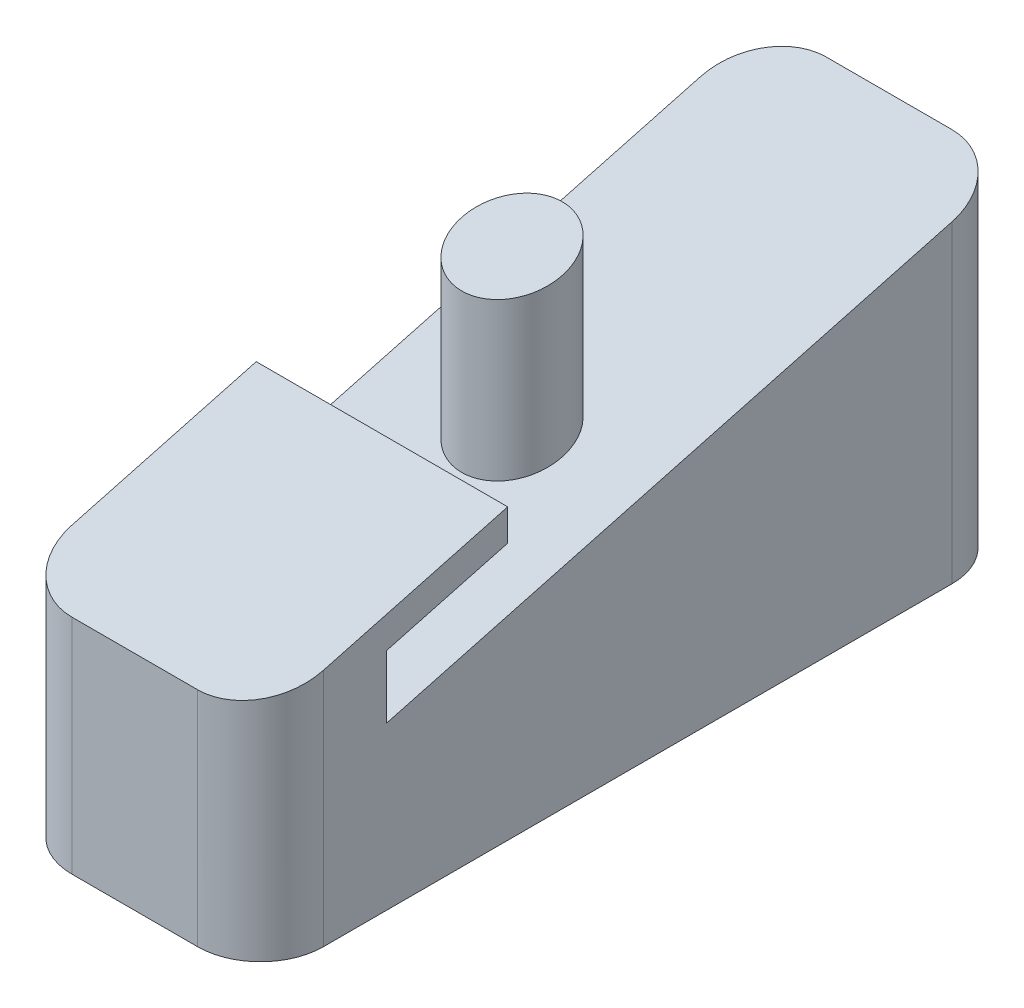
ISO-10303-21;
HEADER;
FILE_DESCRIPTION(('STEP AP214'),'2;1');
FILE_NAME('part.step','',(''),(''),'','','');
FILE_SCHEMA(('AUTOMOTIVE_DESIGN { 1 0 10303 214 1 1 1 1 }'));
ENDSEC;
DATA;
#1=APPLICATION_CONTEXT('core data for automotive mechanical design processes');
#2=APPLICATION_PROTOCOL_DEFINITION('international standard','automotive_design',2000,#1);
#3=PRODUCT_CONTEXT('',#1,'mechanical');
#4=PRODUCT('Part','Part','',(#3));
#5=PRODUCT_RELATED_PRODUCT_CATEGORY('part','',(#4));
#6=PRODUCT_DEFINITION_FORMATION('','',#4);
#7=PRODUCT_DEFINITION_CONTEXT('part definition',#1,'design');
#8=PRODUCT_DEFINITION('design','',#6,#7);
#9=PRODUCT_DEFINITION_SHAPE('','',#8);
#10=(LENGTH_UNIT() NAMED_UNIT(*) SI_UNIT(.MILLI.,.METRE.));
#11=(NAMED_UNIT(*) PLANE_ANGLE_UNIT() SI_UNIT($,.RADIAN.));
#12=(NAMED_UNIT(*) SI_UNIT($,.STERADIAN.) SOLID_ANGLE_UNIT());
#13=UNCERTAINTY_MEASURE_WITH_UNIT(LENGTH_MEASURE(1.E-05),#10,'distance_accuracy_value','');
#14=(GEOMETRIC_REPRESENTATION_CONTEXT(3) GLOBAL_UNCERTAINTY_ASSIGNED_CONTEXT((#13)) GLOBAL_UNIT_ASSIGNED_CONTEXT((#10,
#11,#12)) REPRESENTATION_CONTEXT('',''));
#15=CARTESIAN_POINT('',(0.,0.,0.));
#16=DIRECTION('',(0.,0.,1.));
#17=DIRECTION('',(1.,0.,0.));
#18=AXIS2_PLACEMENT_3D('',#15,#16,#17);
#19=CARTESIAN_POINT('',(-12.7,25.8858262806237,25.4));
#20=DIRECTION('',(0.,0.,-1.));
#21=DIRECTION('',(-1.,0.,0.));
#22=AXIS2_PLACEMENT_3D('',#19,#20,#21);
#23=PLANE('',#22);
#24=DIRECTION('',(0.,-1.,0.));
#25=VECTOR('',#24,1.);
#26=CARTESIAN_POINT('',(-12.7,25.8858262806237,25.4));
#27=LINE('',#26,#25);
#28=CARTESIAN_POINT('',(-12.7,22.7108262806237,25.4));
#29=VERTEX_POINT('',#28);
#30=CARTESIAN_POINT('',(-12.7,16.3608262806237,25.4));
#31=VERTEX_POINT('',#30);
#32=EDGE_CURVE('E161',#29,#31,#27,.T.);
#33=ORIENTED_EDGE('',*,*,#32,.F.);
#34=DIRECTION('',(-1.,0.,0.));
#35=VECTOR('',#34,1.);
#36=CARTESIAN_POINT('',(12.7,22.7108262806237,25.4));
#37=LINE('',#36,#35);
#38=CARTESIAN_POINT('',(12.7,22.7108262806237,25.4));
#39=VERTEX_POINT('',#38);
#40=EDGE_CURVE('E142',#39,#29,#37,.T.);
#41=ORIENTED_EDGE('',*,*,#40,.F.);
#42=DIRECTION('',(0.,-1.,0.));
#43=VECTOR('',#42,1.);
#44=CARTESIAN_POINT('',(12.7,25.8858262806237,25.4));
#45=LINE('',#44,#43);
#46=CARTESIAN_POINT('',(12.7,16.3608262806237,25.4));
#47=VERTEX_POINT('',#46);
#48=EDGE_CURVE('E148',#39,#47,#45,.T.);
#49=ORIENTED_EDGE('',*,*,#48,.T.);
#50=DIRECTION('',(1.,0.,0.));
#51=VECTOR('',#50,1.);
#52=CARTESIAN_POINT('',(-12.7,16.3608262806237,25.4));
#53=LINE('',#52,#51);
#54=EDGE_CURVE('E149',#31,#47,#53,.T.);
#55=ORIENTED_EDGE('',*,*,#54,.F.);
#56=EDGE_LOOP('',(#33,#41,#49,#55));
#57=FACE_BOUND('',#56,.T.);
#58=ADVANCED_FACE('F32',(#57),#23,.T.);
#59=CARTESIAN_POINT('',(0.,33.3756,38.1));
#60=DIRECTION('',(0.,0.,-1.));
#61=DIRECTION('',(-1.,0.,0.));
#62=AXIS2_PLACEMENT_3D('',#59,#60,#61);
#63=PLANE('',#62);
#64=DIRECTION('',(1.,0.,0.));
#65=VECTOR('',#64,1.);
#66=CARTESIAN_POINT('',(-12.7,22.4828715367484,38.1));
#67=LINE('',#66,#65);
#68=CARTESIAN_POINT('',(-6.35,22.4828715367484,38.1));
#69=VERTEX_POINT('',#68);
#70=CARTESIAN_POINT('',(6.35,22.4828715367484,38.1));
#71=VERTEX_POINT('',#70);
#72=EDGE_CURVE('E160',#69,#71,#67,.T.);
#73=ORIENTED_EDGE('',*,*,#72,.F.);
#74=DIRECTION('',(0.,-1.,0.));
#75=VECTOR('',#74,1.);
#76=CARTESIAN_POINT('',(-6.35,0.,38.1));
#77=LINE('',#76,#75);
#78=CARTESIAN_POINT('',(-6.35,0.,38.1));
#79=VERTEX_POINT('',#78);
#80=EDGE_CURVE('E183',#69,#79,#77,.T.);
#81=ORIENTED_EDGE('',*,*,#80,.T.);
#82=DIRECTION('',(1.,0.,0.));
#83=VECTOR('',#82,1.);
#84=CARTESIAN_POINT('',(0.,0.,38.1));
#85=LINE('',#84,#83);
#86=CARTESIAN_POINT('',(6.35,0.,38.1));
#87=VERTEX_POINT('',#86);
#88=EDGE_CURVE('E171',#79,#87,#85,.T.);
#89=ORIENTED_EDGE('',*,*,#88,.T.);
#90=DIRECTION('',(0.,-1.,0.));
#91=VECTOR('',#90,1.);
#92=CARTESIAN_POINT('',(6.35,33.3756,38.1));
#93=LINE('',#92,#91);
#94=EDGE_CURVE('E55',#87,#71,#93,.F.);
#95=ORIENTED_EDGE('',*,*,#94,.T.);
#96=EDGE_LOOP('',(#73,#81,#89,#95));
#97=FACE_BOUND('',#96,.T.);
#98=ADVANCED_FACE('F237',(#97),#63,.F.);
#99=CARTESIAN_POINT('',(12.7,33.3756,0.));
#100=DIRECTION('',(-1.,0.,0.));
#101=DIRECTION('',(0.,0.,1.));
#102=AXIS2_PLACEMENT_3D('',#99,#100,#101);
#103=PLANE('',#102);
#104=DIRECTION('',(0.,0.,-1.));
#105=VECTOR('',#104,1.);
#106=CARTESIAN_POINT('',(12.7,0.,0.));
#107=LINE('',#106,#105);
#108=CARTESIAN_POINT('',(12.7,0.,31.75));
#109=VERTEX_POINT('',#108);
#110=CARTESIAN_POINT('',(12.7,0.,-31.75));
#111=VERTEX_POINT('',#110);
#112=EDGE_CURVE('E191',#109,#111,#107,.T.);
#113=ORIENTED_EDGE('',*,*,#112,.T.);
#114=DIRECTION('',(0.,-1.,0.));
#115=VECTOR('',#114,1.);
#116=CARTESIAN_POINT('',(12.7,33.3756,-31.75));
#117=LINE('',#116,#115);
#118=CARTESIAN_POINT('',(12.7,31.6741226280624,-31.75));
#119=VERTEX_POINT('',#118);
#120=EDGE_CURVE('E11',#111,#119,#117,.F.);
#121=ORIENTED_EDGE('',*,*,#120,.T.);
#122=DIRECTION('',(0.,-0.258819045102522,0.965925826289068));
#123=VECTOR('',#122,1.);
#124=CARTESIAN_POINT('',(12.7,23.8506,-2.55221605790646));
#125=LINE('',#124,#123);
#126=EDGE_CURVE('E168',#119,#47,#125,.T.);
#127=ORIENTED_EDGE('',*,*,#126,.T.);
#128=ORIENTED_EDGE('',*,*,#48,.F.);
#129=DIRECTION('',(0.,-0.258819045102522,0.965925826289068));
#130=VECTOR('',#129,1.);
#131=CARTESIAN_POINT('',(12.7,25.9978281534257,13.1327420061288));
#132=LINE('',#131,#130);
#133=CARTESIAN_POINT('',(12.7,25.9978281534257,13.1327420061288));
#134=VERTEX_POINT('',#133);
#135=EDGE_CURVE('E127',#134,#39,#132,.T.);
#136=ORIENTED_EDGE('',*,*,#135,.F.);
#137=DIRECTION('',(0.,-1.,0.));
#138=VECTOR('',#137,1.);
#139=CARTESIAN_POINT('',(12.7,29.1728281534257,13.1327420061288));
#140=LINE('',#139,#138);
#141=CARTESIAN_POINT('',(12.7,29.1728281534257,13.1327420061288));
#142=VERTEX_POINT('',#141);
#143=EDGE_CURVE('E134',#142,#134,#140,.T.);
#144=ORIENTED_EDGE('',*,*,#143,.F.);
#145=DIRECTION('',(0.,0.258819045102522,-0.965925826289068));
#146=VECTOR('',#145,1.);
#147=CARTESIAN_POINT('',(12.7,22.4828715367484,38.1));
#148=LINE('',#147,#146);
#149=CARTESIAN_POINT('',(12.7,24.184348908686,31.75));
#150=VERTEX_POINT('',#149);
#151=EDGE_CURVE('E158',#150,#142,#148,.T.);
#152=ORIENTED_EDGE('',*,*,#151,.F.);
#153=DIRECTION('',(0.,-1.,0.));
#154=VECTOR('',#153,1.);
#155=CARTESIAN_POINT('',(12.7,33.3756,31.75));
#156=LINE('',#155,#154);
#157=EDGE_CURVE('E40',#150,#109,#156,.T.);
#158=ORIENTED_EDGE('',*,*,#157,.T.);
#159=EDGE_LOOP('',(#113,#121,#127,#128,#136,#144,#152,#158));
#160=FACE_BOUND('',#159,.T.);
#161=ADVANCED_FACE('F146',(#160),#103,.F.);
#162=CARTESIAN_POINT('',(0.,33.3756,-38.1));
#163=DIRECTION('',(0.,0.,-1.));
#164=DIRECTION('',(-1.,0.,0.));
#165=AXIS2_PLACEMENT_3D('',#162,#163,#164);
#166=PLANE('',#165);
#167=DIRECTION('',(1.,0.,0.));
#168=VECTOR('',#167,1.);
#169=CARTESIAN_POINT('',(0.,0.,-38.1));
#170=LINE('',#169,#168);
#171=CARTESIAN_POINT('',(-6.35,0.,-38.1));
#172=VERTEX_POINT('',#171);
#173=CARTESIAN_POINT('',(6.35,0.,-38.1));
#174=VERTEX_POINT('',#173);
#175=EDGE_CURVE('E201',#172,#174,#170,.T.);
#176=ORIENTED_EDGE('',*,*,#175,.F.);
#177=DIRECTION('',(0.,-1.,0.));
#178=VECTOR('',#177,1.);
#179=CARTESIAN_POINT('',(-6.35,33.3756,-38.1));
#180=LINE('',#179,#178);
#181=CARTESIAN_POINT('',(-6.35,33.3756,-38.1));
#182=VERTEX_POINT('',#181);
#183=EDGE_CURVE('E176',#172,#182,#180,.F.);
#184=ORIENTED_EDGE('',*,*,#183,.T.);
#185=DIRECTION('',(1.,0.,0.));
#186=VECTOR('',#185,1.);
#187=CARTESIAN_POINT('',(0.,33.3756,-38.1));
#188=LINE('',#187,#186);
#189=CARTESIAN_POINT('',(6.35,33.3756,-38.1));
#190=VERTEX_POINT('',#189);
#191=EDGE_CURVE('E206',#182,#190,#188,.T.);
#192=ORIENTED_EDGE('',*,*,#191,.T.);
#193=DIRECTION('',(0.,-1.,0.));
#194=VECTOR('',#193,1.);
#195=CARTESIAN_POINT('',(6.35,0.,-38.1));
#196=LINE('',#195,#194);
#197=EDGE_CURVE('E216',#190,#174,#196,.T.);
#198=ORIENTED_EDGE('',*,*,#197,.T.);
#199=EDGE_LOOP('',(#176,#184,#192,#198));
#200=FACE_BOUND('',#199,.T.);
#201=ADVANCED_FACE('F268',(#200),#166,.T.);
#202=CARTESIAN_POINT('',(-12.7,33.3756,0.));
#203=DIRECTION('',(-1.,0.,0.));
#204=DIRECTION('',(0.,0.,1.));
#205=AXIS2_PLACEMENT_3D('',#202,#203,#204);
#206=PLANE('',#205);
#207=DIRECTION('',(0.,0.258819045102522,-0.965925826289068));
#208=VECTOR('',#207,1.);
#209=CARTESIAN_POINT('',(-12.7,12.9578715367484,38.1));
#210=LINE('',#209,#208);
#211=CARTESIAN_POINT('',(-12.7,31.6741226280624,-31.75));
#212=VERTEX_POINT('',#211);
#213=EDGE_CURVE('E164',#31,#212,#210,.T.);
#214=ORIENTED_EDGE('',*,*,#213,.T.);
#215=DIRECTION('',(0.,-1.,0.));
#216=VECTOR('',#215,1.);
#217=CARTESIAN_POINT('',(-12.7,33.3756,-31.75));
#218=LINE('',#217,#216);
#219=CARTESIAN_POINT('',(-12.7,0.,-31.75));
#220=VERTEX_POINT('',#219);
#221=EDGE_CURVE('E225',#212,#220,#218,.T.);
#222=ORIENTED_EDGE('',*,*,#221,.T.);
#223=DIRECTION('',(0.,0.,-1.));
#224=VECTOR('',#223,1.);
#225=CARTESIAN_POINT('',(-12.7,0.,0.));
#226=LINE('',#225,#224);
#227=CARTESIAN_POINT('',(-12.7,0.,31.75));
#228=VERTEX_POINT('',#227);
#229=EDGE_CURVE('E202',#228,#220,#226,.T.);
#230=ORIENTED_EDGE('',*,*,#229,.F.);
#231=DIRECTION('',(0.,-1.,0.));
#232=VECTOR('',#231,1.);
#233=CARTESIAN_POINT('',(-12.7,22.4828715367484,31.75));
#234=LINE('',#233,#232);
#235=CARTESIAN_POINT('',(-12.7,24.184348908686,31.75));
#236=VERTEX_POINT('',#235);
#237=EDGE_CURVE('E209',#228,#236,#234,.F.);
#238=ORIENTED_EDGE('',*,*,#237,.T.);
#239=DIRECTION('',(0.,0.258819045102522,-0.965925826289068));
#240=VECTOR('',#239,1.);
#241=CARTESIAN_POINT('',(-12.7,22.4828715367484,38.1));
#242=LINE('',#241,#240);
#243=CARTESIAN_POINT('',(-12.7,29.1728281534257,13.1327420061288));
#244=VERTEX_POINT('',#243);
#245=EDGE_CURVE('E152',#236,#244,#242,.T.);
#246=ORIENTED_EDGE('',*,*,#245,.T.);
#247=DIRECTION('',(0.,1.,0.));
#248=VECTOR('',#247,1.);
#249=CARTESIAN_POINT('',(-12.7,29.1728281534257,13.1327420061288));
#250=LINE('',#249,#248);
#251=CARTESIAN_POINT('',(-12.7,25.9978281534257,13.1327420061288));
#252=VERTEX_POINT('',#251);
#253=EDGE_CURVE('E133',#252,#244,#250,.T.);
#254=ORIENTED_EDGE('',*,*,#253,.F.);
#255=DIRECTION('',(0.,-0.258819045102522,0.965925826289068));
#256=VECTOR('',#255,1.);
#257=CARTESIAN_POINT('',(-12.7,25.9978281534257,13.1327420061288));
#258=LINE('',#257,#256);
#259=EDGE_CURVE('E129',#252,#29,#258,.T.);
#260=ORIENTED_EDGE('',*,*,#259,.T.);
#261=ORIENTED_EDGE('',*,*,#32,.T.);
#262=EDGE_LOOP('',(#214,#222,#230,#238,#246,#254,#260,#261));
#263=FACE_BOUND('',#262,.T.);
#264=ADVANCED_FACE('F231',(#263),#206,.T.);
#265=CARTESIAN_POINT('',(0.,0.,0.));
#266=DIRECTION('',(0.,1.,0.));
#267=DIRECTION('',(0.,0.,1.));
#268=AXIS2_PLACEMENT_3D('',#265,#266,#267);
#269=PLANE('',#268);
#270=CARTESIAN_POINT('',(0.,0.,0.));
#271=DIRECTION('',(0.,-1.,0.));
#272=DIRECTION('',(0.,0.,-1.));
#273=AXIS2_PLACEMENT_3D('',#270,#271,#272);
#274=CIRCLE('',#273,5.715);
#275=CARTESIAN_POINT('',(0.,0.,-5.715));
#276=VERTEX_POINT('',#275);
#277=EDGE_CURVE('E422',#276,#276,#274,.T.);
#278=ORIENTED_EDGE('',*,*,#277,.F.);
#279=EDGE_LOOP('',(#278));
#280=FACE_BOUND('',#279,.T.);
#281=ORIENTED_EDGE('',*,*,#229,.T.);
#282=CARTESIAN_POINT('',(-6.35,0.,-31.75));
#283=DIRECTION('',(0.,1.,0.));
#284=DIRECTION('',(0.,0.,1.));
#285=AXIS2_PLACEMENT_3D('',#282,#283,#284);
#286=CIRCLE('',#285,6.35);
#287=EDGE_CURVE('E214',#220,#172,#286,.F.);
#288=ORIENTED_EDGE('',*,*,#287,.T.);
#289=ORIENTED_EDGE('',*,*,#175,.T.);
#290=CARTESIAN_POINT('',(6.35,0.,-31.75));
#291=DIRECTION('',(0.,1.,0.));
#292=DIRECTION('',(0.,0.,1.));
#293=AXIS2_PLACEMENT_3D('',#290,#291,#292);
#294=CIRCLE('',#293,6.35);
#295=EDGE_CURVE('E200',#174,#111,#294,.F.);
#296=ORIENTED_EDGE('',*,*,#295,.T.);
#297=ORIENTED_EDGE('',*,*,#112,.F.);
#298=CARTESIAN_POINT('',(6.35,0.,31.75));
#299=DIRECTION('',(0.,1.,0.));
#300=DIRECTION('',(0.,0.,1.));
#301=AXIS2_PLACEMENT_3D('',#298,#299,#300);
#302=CIRCLE('',#301,6.35);
#303=EDGE_CURVE('E198',#109,#87,#302,.F.);
#304=ORIENTED_EDGE('',*,*,#303,.T.);
#305=ORIENTED_EDGE('',*,*,#88,.F.);
#306=CARTESIAN_POINT('',(-6.35,0.,31.75));
#307=DIRECTION('',(0.,1.,0.));
#308=DIRECTION('',(0.,0.,1.));
#309=AXIS2_PLACEMENT_3D('',#306,#307,#308);
#310=CIRCLE('',#309,6.35);
#311=EDGE_CURVE('E221',#79,#228,#310,.F.);
#312=ORIENTED_EDGE('',*,*,#311,.T.);
#313=EDGE_LOOP('',(#281,#288,#289,#296,#297,#304,#305,#312));
#314=FACE_BOUND('',#313,.T.);
#315=ADVANCED_FACE('F196',(#280,#314),#269,.F.);
#316=CARTESIAN_POINT('',(-12.7,12.9578715367484,38.1));
#317=DIRECTION('',(0.,-0.965925826289068,-0.258819045102522));
#318=DIRECTION('',(0.,0.258819045102522,-0.965925826289068));
#319=AXIS2_PLACEMENT_3D('',#316,#317,#318);
#320=PLANE('',#319);
#321=CARTESIAN_POINT('',(0.,21.8055538708772,5.08));
#322=CARTESIAN_POINT('',(-10.16,21.8055538708772,5.08));
#323=CARTESIAN_POINT('',(-10.16,24.5279176659774,-5.08));
#324=CARTESIAN_POINT('',(0.,24.5279176659774,-5.08));
#325=CARTESIAN_POINT('',(10.16,24.5279176659774,-5.08));
#326=CARTESIAN_POINT('',(10.16,21.8055538708772,5.08));
#327=CARTESIAN_POINT('',(0.,21.8055538708772,5.08));
#328=(BOUNDED_CURVE() B_SPLINE_CURVE(3,(#321,#322,#323,#324,#325,#326,#327),.UNSPECIFIED.,.T.,
.F.) B_SPLINE_CURVE_WITH_KNOTS((4,3,4),(0.,0.5,1.),
.UNSPECIFIED.) CURVE() GEOMETRIC_REPRESENTATION_ITEM() RATIONAL_B_SPLINE_CURVE((1.,
0.333333333333333,0.333333333333333,1.,0.333333333333333,0.333333333333333,1.)) REPRESENTATION_ITEM(''));
#329=CARTESIAN_POINT('',(0.,21.8055538708772,5.08));
#330=VERTEX_POINT('',#329);
#331=EDGE_CURVE('E421',#330,#330,#328,.T.);
#332=ORIENTED_EDGE('',*,*,#331,.T.);
#333=EDGE_LOOP('',(#332));
#334=FACE_BOUND('',#333,.T.);
#335=ORIENTED_EDGE('',*,*,#191,.F.);
#336=CARTESIAN_POINT('',(-6.35,31.6741226280624,-31.75));
#337=DIRECTION('',(0.,-0.965925826289068,-0.258819045102522));
#338=DIRECTION('',(0.,-0.258819045102522,0.965925826289068));
#339=AXIS2_PLACEMENT_3D('',#336,#337,#338);
#340=ELLIPSE('',#339,6.57400374560403,6.35);
#341=EDGE_CURVE('E180',#182,#212,#340,.F.);
#342=ORIENTED_EDGE('',*,*,#341,.T.);
#343=ORIENTED_EDGE('',*,*,#213,.F.);
#344=ORIENTED_EDGE('',*,*,#54,.T.);
#345=ORIENTED_EDGE('',*,*,#126,.F.);
#346=CARTESIAN_POINT('',(6.35,31.6741226280624,-31.75));
#347=DIRECTION('',(0.,-0.965925826289068,-0.258819045102522));
#348=DIRECTION('',(0.,0.258819045102522,-0.965925826289068));
#349=AXIS2_PLACEMENT_3D('',#346,#347,#348);
#350=ELLIPSE('',#349,6.57400374560403,6.35);
#351=EDGE_CURVE('E178',#119,#190,#350,.F.);
#352=ORIENTED_EDGE('',*,*,#351,.T.);
#353=EDGE_LOOP('',(#335,#342,#343,#344,#345,#352));
#354=FACE_BOUND('',#353,.T.);
#355=ADVANCED_FACE('F259',(#334,#354),#320,.F.);
#356=CARTESIAN_POINT('',(0.,31.1398587332739,5.79168394209356));
#357=DIRECTION('',(0.,-0.965925826289068,-0.258819045102522));
#358=DIRECTION('',(0.,0.258819045102522,-0.965925826289068));
#359=AXIS2_PLACEMENT_3D('',#356,#357,#358);
#360=PLANE('',#359);
#361=ORIENTED_EDGE('',*,*,#245,.F.);
#362=CARTESIAN_POINT('',(-6.35,24.184348908686,31.75));
#363=DIRECTION('',(0.,-0.965925826289068,-0.258819045102522));
#364=DIRECTION('',(0.,0.258819045102522,-0.965925826289068));
#365=AXIS2_PLACEMENT_3D('',#362,#363,#364);
#366=ELLIPSE('',#365,6.57400374560403,6.35);
#367=EDGE_CURVE('E187',#236,#69,#366,.F.);
#368=ORIENTED_EDGE('',*,*,#367,.T.);
#369=ORIENTED_EDGE('',*,*,#72,.T.);
#370=CARTESIAN_POINT('',(6.35,24.184348908686,31.75));
#371=DIRECTION('',(0.,-0.965925826289068,-0.258819045102522));
#372=DIRECTION('',(0.,-0.258819045102522,0.965925826289068));
#373=AXIS2_PLACEMENT_3D('',#370,#371,#372);
#374=ELLIPSE('',#373,6.57400374560403,6.35);
#375=EDGE_CURVE('E47',#71,#150,#374,.F.);
#376=ORIENTED_EDGE('',*,*,#375,.T.);
#377=ORIENTED_EDGE('',*,*,#151,.T.);
#378=DIRECTION('',(1.,0.,0.));
#379=VECTOR('',#378,1.);
#380=CARTESIAN_POINT('',(12.7,29.1728281534257,13.1327420061288));
#381=LINE('',#380,#379);
#382=EDGE_CURVE('E140',#244,#142,#381,.T.);
#383=ORIENTED_EDGE('',*,*,#382,.F.);
#384=EDGE_LOOP('',(#361,#368,#369,#376,#377,#383));
#385=FACE_BOUND('',#384,.T.);
#386=ADVANCED_FACE('F234',(#385),#360,.F.);
#387=CARTESIAN_POINT('',(12.7,25.9978281534257,13.1327420061288));
#388=DIRECTION('',(0.,0.965925826289068,0.258819045102522));
#389=DIRECTION('',(0.,-0.258819045102522,0.965925826289068));
#390=AXIS2_PLACEMENT_3D('',#387,#388,#389);
#391=PLANE('',#390);
#392=ORIENTED_EDGE('',*,*,#40,.T.);
#393=ORIENTED_EDGE('',*,*,#259,.F.);
#394=DIRECTION('',(-1.,0.,0.));
#395=VECTOR('',#394,1.);
#396=CARTESIAN_POINT('',(12.7,25.9978281534257,13.1327420061288));
#397=LINE('',#396,#395);
#398=EDGE_CURVE('E122',#134,#252,#397,.T.);
#399=ORIENTED_EDGE('',*,*,#398,.F.);
#400=ORIENTED_EDGE('',*,*,#135,.T.);
#401=EDGE_LOOP('',(#392,#393,#399,#400));
#402=FACE_BOUND('',#401,.T.);
#403=ADVANCED_FACE('F125',(#402),#391,.F.);
#404=CARTESIAN_POINT('',(0.,3.28700187280203,13.1327420061288));
#405=DIRECTION('',(0.,0.,-1.));
#406=DIRECTION('',(-1.,0.,0.));
#407=AXIS2_PLACEMENT_3D('',#404,#405,#406);
#408=PLANE('',#407);
#409=ORIENTED_EDGE('',*,*,#143,.T.);
#410=ORIENTED_EDGE('',*,*,#398,.T.);
#411=ORIENTED_EDGE('',*,*,#253,.T.);
#412=ORIENTED_EDGE('',*,*,#382,.T.);
#413=EDGE_LOOP('',(#409,#410,#411,#412));
#414=FACE_BOUND('',#413,.T.);
#415=ADVANCED_FACE('F138',(#414),#408,.T.);
#416=CARTESIAN_POINT('',(-6.35,33.3756,-31.75));
#417=DIRECTION('',(0.,-1.,0.));
#418=DIRECTION('',(0.,0.,-1.));
#419=AXIS2_PLACEMENT_3D('',#416,#417,#418);
#420=CYLINDRICAL_SURFACE('',#419,6.35);
#421=ORIENTED_EDGE('',*,*,#341,.F.);
#422=ORIENTED_EDGE('',*,*,#183,.F.);
#423=ORIENTED_EDGE('',*,*,#287,.F.);
#424=ORIENTED_EDGE('',*,*,#221,.F.);
#425=EDGE_LOOP('',(#421,#422,#423,#424));
#426=FACE_BOUND('',#425,.T.);
#427=ADVANCED_FACE('F273',(#426),#420,.T.);
#428=CARTESIAN_POINT('',(-6.35,33.3756,31.75));
#429=DIRECTION('',(0.,1.,0.));
#430=DIRECTION('',(0.,0.,1.));
#431=AXIS2_PLACEMENT_3D('',#428,#429,#430);
#432=CYLINDRICAL_SURFACE('',#431,6.35);
#433=ORIENTED_EDGE('',*,*,#367,.F.);
#434=ORIENTED_EDGE('',*,*,#237,.F.);
#435=ORIENTED_EDGE('',*,*,#311,.F.);
#436=ORIENTED_EDGE('',*,*,#80,.F.);
#437=EDGE_LOOP('',(#433,#434,#435,#436));
#438=FACE_BOUND('',#437,.T.);
#439=ADVANCED_FACE('F236',(#438),#432,.T.);
#440=CARTESIAN_POINT('',(6.35,33.3756,-31.75));
#441=DIRECTION('',(0.,1.,0.));
#442=DIRECTION('',(0.,0.,1.));
#443=AXIS2_PLACEMENT_3D('',#440,#441,#442);
#444=CYLINDRICAL_SURFACE('',#443,6.35);
#445=ORIENTED_EDGE('',*,*,#351,.F.);
#446=ORIENTED_EDGE('',*,*,#120,.F.);
#447=ORIENTED_EDGE('',*,*,#295,.F.);
#448=ORIENTED_EDGE('',*,*,#197,.F.);
#449=EDGE_LOOP('',(#445,#446,#447,#448));
#450=FACE_BOUND('',#449,.T.);
#451=ADVANCED_FACE('F240',(#450),#444,.T.);
#452=CARTESIAN_POINT('',(6.35,33.3756,31.75));
#453=DIRECTION('',(0.,-1.,0.));
#454=DIRECTION('',(0.,0.,-1.));
#455=AXIS2_PLACEMENT_3D('',#452,#453,#454);
#456=CYLINDRICAL_SURFACE('',#455,6.35);
#457=ORIENTED_EDGE('',*,*,#375,.F.);
#458=ORIENTED_EDGE('',*,*,#94,.F.);
#459=ORIENTED_EDGE('',*,*,#303,.F.);
#460=ORIENTED_EDGE('',*,*,#157,.F.);
#461=EDGE_LOOP('',(#457,#458,#459,#460));
#462=FACE_BOUND('',#461,.T.);
#463=ADVANCED_FACE('F34',(#462),#456,.T.);
#464=CARTESIAN_POINT('',(0.,37.6805538708772,0.));
#465=DIRECTION('',(0.,-1.,0.));
#466=DIRECTION('',(0.,0.,-1.));
#467=AXIS2_PLACEMENT_3D('',#464,#465,#466);
#468=CYLINDRICAL_SURFACE('',#467,5.08);
#469=CARTESIAN_POINT('',(0.,37.6805538708772,5.08));
#470=CARTESIAN_POINT('',(-10.16,37.6805538708772,5.08));
#471=CARTESIAN_POINT('',(-10.16,40.4029176659774,-5.08));
#472=CARTESIAN_POINT('',(0.,40.4029176659774,-5.08));
#473=CARTESIAN_POINT('',(10.16,40.4029176659774,-5.08));
#474=CARTESIAN_POINT('',(10.16,37.6805538708772,5.08));
#475=CARTESIAN_POINT('',(0.,37.6805538708772,5.08));
#476=(BOUNDED_CURVE() B_SPLINE_CURVE(3,(#469,#470,#471,#472,#473,#474,#475),.UNSPECIFIED.,.T.,
.F.) B_SPLINE_CURVE_WITH_KNOTS((4,3,4),(0.,0.5,1.),
.UNSPECIFIED.) CURVE() GEOMETRIC_REPRESENTATION_ITEM() RATIONAL_B_SPLINE_CURVE((1.,
0.333333333333333,0.333333333333333,1.,0.333333333333333,0.333333333333333,1.)) REPRESENTATION_ITEM(''));
#477=CARTESIAN_POINT('',(0.,37.6805538708772,5.08));
#478=VERTEX_POINT('',#477);
#479=EDGE_CURVE('E425',#478,#478,#476,.T.);
#480=ORIENTED_EDGE('',*,*,#479,.T.);
#481=EDGE_LOOP('',(#480));
#482=FACE_BOUND('',#481,.T.);
#483=ORIENTED_EDGE('',*,*,#331,.F.);
#484=EDGE_LOOP('',(#483));
#485=FACE_BOUND('',#484,.T.);
#486=ADVANCED_FACE('F239',(#482,#485),#468,.T.);
#487=CARTESIAN_POINT('',(0.,40.4029176659774,-5.08));
#488=DIRECTION('',(0.,0.965925826289068,0.258819045102522));
#489=DIRECTION('',(0.,-0.258819045102522,0.965925826289068));
#490=AXIS2_PLACEMENT_3D('',#487,#488,#489);
#491=PLANE('',#490);
#492=ORIENTED_EDGE('',*,*,#479,.F.);
#493=EDGE_LOOP('',(#492));
#494=FACE_BOUND('',#493,.T.);
#495=ADVANCED_FACE('F245',(#494),#491,.T.);
#496=CARTESIAN_POINT('',(0.,15.875,0.));
#497=DIRECTION('',(0.,-1.,0.));
#498=DIRECTION('',(0.,0.,-1.));
#499=AXIS2_PLACEMENT_3D('',#496,#497,#498);
#500=CYLINDRICAL_SURFACE('',#499,5.715);
#501=CARTESIAN_POINT('',(0.,15.875,0.));
#502=DIRECTION('',(0.,-1.,0.));
#503=DIRECTION('',(0.,0.,-1.));
#504=AXIS2_PLACEMENT_3D('',#501,#502,#503);
#505=CIRCLE('',#504,5.715);
#506=CARTESIAN_POINT('',(0.,15.875,-5.715));
#507=VERTEX_POINT('',#506);
#508=EDGE_CURVE('E420',#507,#507,#505,.T.);
#509=ORIENTED_EDGE('',*,*,#508,.F.);
#510=EDGE_LOOP('',(#509));
#511=FACE_BOUND('',#510,.T.);
#512=ORIENTED_EDGE('',*,*,#277,.T.);
#513=EDGE_LOOP('',(#512));
#514=FACE_BOUND('',#513,.T.);
#515=ADVANCED_FACE('F315',(#511,#514),#500,.F.);
#516=CARTESIAN_POINT('',(0.,15.875,0.));
#517=DIRECTION('',(0.,-1.,0.));
#518=DIRECTION('',(0.,0.,-1.));
#519=AXIS2_PLACEMENT_3D('',#516,#517,#518);
#520=PLANE('',#519);
#521=ORIENTED_EDGE('',*,*,#508,.T.);
#522=EDGE_LOOP('',(#521));
#523=FACE_BOUND('',#522,.T.);
#524=ADVANCED_FACE('F331',(#523),#520,.T.);
#525=CLOSED_SHELL('',(#58,#98,#161,#201,#264,#315,#355,#386,#403,#415,#427,#439,#451,#463,#486,
#495,#515,#524));
#526=MANIFOLD_SOLID_BREP('B2',#525);
#527=ADVANCED_BREP_SHAPE_REPRESENTATION('',(#18,#526),#14);
#528=SHAPE_DEFINITION_REPRESENTATION(#9,#527);
ENDSEC;
END-ISO-10303-21;
